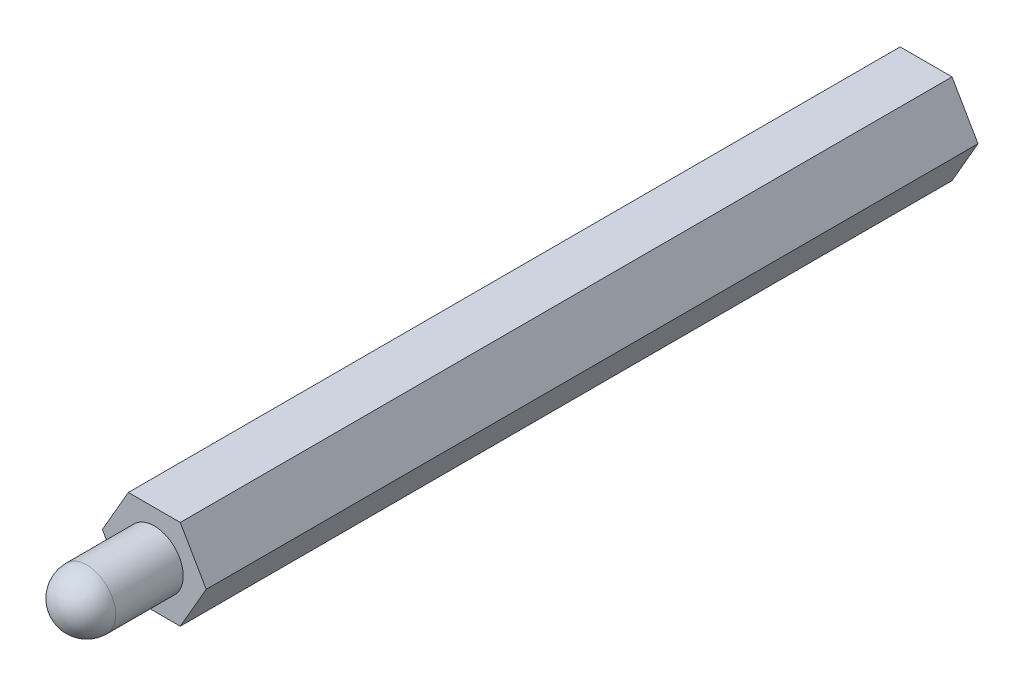
ISO-10303-21;
HEADER;
FILE_DESCRIPTION(('STEP AP214'),'2;1');
FILE_NAME('part.step','',(''),(''),'','','');
FILE_SCHEMA(('AUTOMOTIVE_DESIGN { 1 0 10303 214 1 1 1 1 }'));
ENDSEC;
DATA;
#1=APPLICATION_CONTEXT('core data for automotive mechanical design processes');
#2=APPLICATION_PROTOCOL_DEFINITION('international standard','automotive_design',2000,#1);
#3=PRODUCT_CONTEXT('',#1,'mechanical');
#4=PRODUCT('Part','Part','',(#3));
#5=PRODUCT_RELATED_PRODUCT_CATEGORY('part','',(#4));
#6=PRODUCT_DEFINITION_FORMATION('','',#4);
#7=PRODUCT_DEFINITION_CONTEXT('part definition',#1,'design');
#8=PRODUCT_DEFINITION('design','',#6,#7);
#9=PRODUCT_DEFINITION_SHAPE('','',#8);
#10=(LENGTH_UNIT() NAMED_UNIT(*) SI_UNIT(.MILLI.,.METRE.));
#11=(NAMED_UNIT(*) PLANE_ANGLE_UNIT() SI_UNIT($,.RADIAN.));
#12=(NAMED_UNIT(*) SI_UNIT($,.STERADIAN.) SOLID_ANGLE_UNIT());
#13=UNCERTAINTY_MEASURE_WITH_UNIT(LENGTH_MEASURE(1.E-05),#10,'distance_accuracy_value','');
#14=(GEOMETRIC_REPRESENTATION_CONTEXT(3) GLOBAL_UNCERTAINTY_ASSIGNED_CONTEXT((#13)) GLOBAL_UNIT_ASSIGNED_CONTEXT((#10,
#11,#12)) REPRESENTATION_CONTEXT('',''));
#15=CARTESIAN_POINT('',(0.,0.,0.));
#16=DIRECTION('',(0.,0.,1.));
#17=DIRECTION('',(1.,0.,0.));
#18=AXIS2_PLACEMENT_3D('',#15,#16,#17);
#19=CARTESIAN_POINT('',(0.,0.,40.));
#20=DIRECTION('',(0.,0.,1.));
#21=DIRECTION('',(1.,0.,0.));
#22=AXIS2_PLACEMENT_3D('',#19,#20,#21);
#23=PLANE('',#22);
#24=DIRECTION('',(0.499999999999995,0.866025403784442,0.));
#25=VECTOR('',#24,1.);
#26=CARTESIAN_POINT('',(1.34522612721185,-2.32999999999998,40.));
#27=LINE('',#26,#25);
#28=CARTESIAN_POINT('',(1.34522612721185,-2.32999999999998,40.));
#29=VERTEX_POINT('',#28);
#30=CARTESIAN_POINT('',(2.69045225442365,0.,40.));
#31=VERTEX_POINT('',#30);
#32=EDGE_CURVE('E131',#29,#31,#27,.T.);
#33=ORIENTED_EDGE('',*,*,#32,.T.);
#34=DIRECTION('',(-0.500000000000001,0.866025403784438,0.));
#35=VECTOR('',#34,1.);
#36=CARTESIAN_POINT('',(2.69045225442365,0.,40.));
#37=LINE('',#36,#35);
#38=CARTESIAN_POINT('',(1.34522612721182,2.33,40.));
#39=VERTEX_POINT('',#38);
#40=EDGE_CURVE('E89',#31,#39,#37,.T.);
#41=ORIENTED_EDGE('',*,*,#40,.T.);
#42=DIRECTION('',(-1.,0.,0.));
#43=VECTOR('',#42,1.);
#44=CARTESIAN_POINT('',(1.34522612721182,2.33,40.));
#45=LINE('',#44,#43);
#46=CARTESIAN_POINT('',(-1.34522612721183,2.32999999999999,40.));
#47=VERTEX_POINT('',#46);
#48=EDGE_CURVE('E102',#39,#47,#45,.T.);
#49=ORIENTED_EDGE('',*,*,#48,.T.);
#50=DIRECTION('',(-0.499999999999995,-0.866025403784441,0.));
#51=VECTOR('',#50,1.);
#52=CARTESIAN_POINT('',(-1.34522612721183,2.32999999999999,40.));
#53=LINE('',#52,#51);
#54=CARTESIAN_POINT('',(-2.69045225442365,0.,40.));
#55=VERTEX_POINT('',#54);
#56=EDGE_CURVE('E96',#47,#55,#53,.T.);
#57=ORIENTED_EDGE('',*,*,#56,.T.);
#58=DIRECTION('',(0.500000000000007,-0.866025403784435,0.));
#59=VECTOR('',#58,1.);
#60=CARTESIAN_POINT('',(-2.69045225442365,0.,40.));
#61=LINE('',#60,#59);
#62=CARTESIAN_POINT('',(-1.3452261272118,-2.33,40.));
#63=VERTEX_POINT('',#62);
#64=EDGE_CURVE('E100',#55,#63,#61,.T.);
#65=ORIENTED_EDGE('',*,*,#64,.T.);
#66=DIRECTION('',(1.,0.,0.));
#67=VECTOR('',#66,1.);
#68=CARTESIAN_POINT('',(-1.3452261272118,-2.33,40.));
#69=LINE('',#68,#67);
#70=EDGE_CURVE('E51',#63,#29,#69,.T.);
#71=ORIENTED_EDGE('',*,*,#70,.T.);
#72=EDGE_LOOP('',(#33,#41,#49,#57,#65,#71));
#73=FACE_BOUND('',#72,.T.);
#74=CARTESIAN_POINT('',(0.,0.,40.));
#75=DIRECTION('',(0.,0.,1.));
#76=DIRECTION('',(1.,0.,0.));
#77=AXIS2_PLACEMENT_3D('',#74,#75,#76);
#78=CIRCLE('',#77,1.5);
#79=CARTESIAN_POINT('',(1.5,0.,40.));
#80=VERTEX_POINT('',#79);
#81=EDGE_CURVE('E124',#80,#80,#78,.T.);
#82=ORIENTED_EDGE('',*,*,#81,.F.);
#83=EDGE_LOOP('',(#82));
#84=FACE_BOUND('',#83,.T.);
#85=ADVANCED_FACE('F34',(#73,#84),#23,.T.);
#86=CARTESIAN_POINT('',(1.34522612721185,-2.32999999999998,40.));
#87=DIRECTION('',(-0.866025403784442,0.499999999999995,0.));
#88=DIRECTION('',(-0.499999999999995,-0.866025403784442,0.));
#89=AXIS2_PLACEMENT_3D('',#86,#87,#88);
#90=PLANE('',#89);
#91=DIRECTION('',(0.499999999999995,0.866025403784442,0.));
#92=VECTOR('',#91,1.);
#93=CARTESIAN_POINT('',(1.34522612721185,-2.32999999999998,0.));
#94=LINE('',#93,#92);
#95=CARTESIAN_POINT('',(1.34522612721185,-2.32999999999998,0.));
#96=VERTEX_POINT('',#95);
#97=CARTESIAN_POINT('',(2.69045225442365,0.,0.));
#98=VERTEX_POINT('',#97);
#99=EDGE_CURVE('E120',#96,#98,#94,.T.);
#100=ORIENTED_EDGE('',*,*,#99,.T.);
#101=DIRECTION('',(0.,0.,-1.));
#102=VECTOR('',#101,1.);
#103=CARTESIAN_POINT('',(2.69045225442365,0.,40.));
#104=LINE('',#103,#102);
#105=EDGE_CURVE('E43',#31,#98,#104,.T.);
#106=ORIENTED_EDGE('',*,*,#105,.F.);
#107=ORIENTED_EDGE('',*,*,#32,.F.);
#108=DIRECTION('',(0.,0.,-1.));
#109=VECTOR('',#108,1.);
#110=CARTESIAN_POINT('',(1.34522612721185,-2.32999999999998,40.));
#111=LINE('',#110,#109);
#112=EDGE_CURVE('E116',#29,#96,#111,.T.);
#113=ORIENTED_EDGE('',*,*,#112,.T.);
#114=EDGE_LOOP('',(#100,#106,#107,#113));
#115=FACE_BOUND('',#114,.T.);
#116=ADVANCED_FACE('F142',(#115),#90,.F.);
#117=CARTESIAN_POINT('',(2.69045225442365,0.,40.));
#118=DIRECTION('',(-0.866025403784438,-0.500000000000001,0.));
#119=DIRECTION('',(0.500000000000001,-0.866025403784438,0.));
#120=AXIS2_PLACEMENT_3D('',#117,#118,#119);
#121=PLANE('',#120);
#122=DIRECTION('',(-0.500000000000001,0.866025403784438,0.));
#123=VECTOR('',#122,1.);
#124=CARTESIAN_POINT('',(2.69045225442365,0.,0.));
#125=LINE('',#124,#123);
#126=CARTESIAN_POINT('',(1.34522612721182,2.33,0.));
#127=VERTEX_POINT('',#126);
#128=EDGE_CURVE('E123',#98,#127,#125,.T.);
#129=ORIENTED_EDGE('',*,*,#128,.T.);
#130=DIRECTION('',(0.,0.,-1.));
#131=VECTOR('',#130,1.);
#132=CARTESIAN_POINT('',(1.34522612721182,2.33,40.));
#133=LINE('',#132,#131);
#134=EDGE_CURVE('E135',#39,#127,#133,.T.);
#135=ORIENTED_EDGE('',*,*,#134,.F.);
#136=ORIENTED_EDGE('',*,*,#40,.F.);
#137=ORIENTED_EDGE('',*,*,#105,.T.);
#138=EDGE_LOOP('',(#129,#135,#136,#137));
#139=FACE_BOUND('',#138,.T.);
#140=ADVANCED_FACE('F138',(#139),#121,.F.);
#141=CARTESIAN_POINT('',(1.34522612721182,2.33,40.));
#142=DIRECTION('',(0.,-1.,0.));
#143=DIRECTION('',(1.,0.,0.));
#144=AXIS2_PLACEMENT_3D('',#141,#142,#143);
#145=PLANE('',#144);
#146=DIRECTION('',(-1.,0.,0.));
#147=VECTOR('',#146,1.);
#148=CARTESIAN_POINT('',(1.34522612721182,2.33,0.));
#149=LINE('',#148,#147);
#150=CARTESIAN_POINT('',(-1.34522612721183,2.32999999999999,0.));
#151=VERTEX_POINT('',#150);
#152=EDGE_CURVE('E126',#127,#151,#149,.T.);
#153=ORIENTED_EDGE('',*,*,#152,.T.);
#154=DIRECTION('',(0.,0.,-1.));
#155=VECTOR('',#154,1.);
#156=CARTESIAN_POINT('',(-1.34522612721183,2.32999999999999,40.));
#157=LINE('',#156,#155);
#158=EDGE_CURVE('E111',#47,#151,#157,.T.);
#159=ORIENTED_EDGE('',*,*,#158,.F.);
#160=ORIENTED_EDGE('',*,*,#48,.F.);
#161=ORIENTED_EDGE('',*,*,#134,.T.);
#162=EDGE_LOOP('',(#153,#159,#160,#161));
#163=FACE_BOUND('',#162,.T.);
#164=ADVANCED_FACE('F147',(#163),#145,.F.);
#165=CARTESIAN_POINT('',(-1.34522612721183,2.32999999999999,40.));
#166=DIRECTION('',(0.866025403784442,-0.499999999999995,0.));
#167=DIRECTION('',(0.499999999999995,0.866025403784442,0.));
#168=AXIS2_PLACEMENT_3D('',#165,#166,#167);
#169=PLANE('',#168);
#170=DIRECTION('',(-0.499999999999995,-0.866025403784441,0.));
#171=VECTOR('',#170,1.);
#172=CARTESIAN_POINT('',(-1.34522612721183,2.32999999999999,0.));
#173=LINE('',#172,#171);
#174=CARTESIAN_POINT('',(-2.69045225442365,0.,0.));
#175=VERTEX_POINT('',#174);
#176=EDGE_CURVE('E110',#151,#175,#173,.T.);
#177=ORIENTED_EDGE('',*,*,#176,.T.);
#178=DIRECTION('',(0.,0.,-1.));
#179=VECTOR('',#178,1.);
#180=CARTESIAN_POINT('',(-2.69045225442365,0.,40.));
#181=LINE('',#180,#179);
#182=EDGE_CURVE('E107',#55,#175,#181,.T.);
#183=ORIENTED_EDGE('',*,*,#182,.F.);
#184=ORIENTED_EDGE('',*,*,#56,.F.);
#185=ORIENTED_EDGE('',*,*,#158,.T.);
#186=EDGE_LOOP('',(#177,#183,#184,#185));
#187=FACE_BOUND('',#186,.T.);
#188=ADVANCED_FACE('F108',(#187),#169,.F.);
#189=CARTESIAN_POINT('',(-2.69045225442365,0.,40.));
#190=DIRECTION('',(0.866025403784435,0.500000000000007,0.));
#191=DIRECTION('',(-0.500000000000007,0.866025403784435,0.));
#192=AXIS2_PLACEMENT_3D('',#189,#190,#191);
#193=PLANE('',#192);
#194=DIRECTION('',(0.500000000000007,-0.866025403784435,0.));
#195=VECTOR('',#194,1.);
#196=CARTESIAN_POINT('',(-2.69045225442365,0.,0.));
#197=LINE('',#196,#195);
#198=CARTESIAN_POINT('',(-1.3452261272118,-2.33,0.));
#199=VERTEX_POINT('',#198);
#200=EDGE_CURVE('E74',#175,#199,#197,.T.);
#201=ORIENTED_EDGE('',*,*,#200,.T.);
#202=DIRECTION('',(0.,0.,-1.));
#203=VECTOR('',#202,1.);
#204=CARTESIAN_POINT('',(-1.3452261272118,-2.33,40.));
#205=LINE('',#204,#203);
#206=EDGE_CURVE('E112',#63,#199,#205,.T.);
#207=ORIENTED_EDGE('',*,*,#206,.F.);
#208=ORIENTED_EDGE('',*,*,#64,.F.);
#209=ORIENTED_EDGE('',*,*,#182,.T.);
#210=EDGE_LOOP('',(#201,#207,#208,#209));
#211=FACE_BOUND('',#210,.T.);
#212=ADVANCED_FACE('F114',(#211),#193,.F.);
#213=CARTESIAN_POINT('',(-1.3452261272118,-2.33,40.));
#214=DIRECTION('',(0.,1.,0.));
#215=DIRECTION('',(-1.,0.,0.));
#216=AXIS2_PLACEMENT_3D('',#213,#214,#215);
#217=PLANE('',#216);
#218=DIRECTION('',(1.,0.,0.));
#219=VECTOR('',#218,1.);
#220=CARTESIAN_POINT('',(-1.3452261272118,-2.33,0.));
#221=LINE('',#220,#219);
#222=EDGE_CURVE('E80',#199,#96,#221,.T.);
#223=ORIENTED_EDGE('',*,*,#222,.T.);
#224=ORIENTED_EDGE('',*,*,#112,.F.);
#225=ORIENTED_EDGE('',*,*,#70,.F.);
#226=ORIENTED_EDGE('',*,*,#206,.T.);
#227=EDGE_LOOP('',(#223,#224,#225,#226));
#228=FACE_BOUND('',#227,.T.);
#229=ADVANCED_FACE('F164',(#228),#217,.F.);
#230=CARTESIAN_POINT('',(0.,0.,0.));
#231=DIRECTION('',(0.,0.,1.));
#232=DIRECTION('',(1.,0.,0.));
#233=AXIS2_PLACEMENT_3D('',#230,#231,#232);
#234=PLANE('',#233);
#235=ORIENTED_EDGE('',*,*,#99,.F.);
#236=ORIENTED_EDGE('',*,*,#222,.F.);
#237=ORIENTED_EDGE('',*,*,#200,.F.);
#238=ORIENTED_EDGE('',*,*,#176,.F.);
#239=ORIENTED_EDGE('',*,*,#152,.F.);
#240=ORIENTED_EDGE('',*,*,#128,.F.);
#241=EDGE_LOOP('',(#235,#236,#237,#238,#239,#240));
#242=FACE_BOUND('',#241,.T.);
#243=ADVANCED_FACE('F144',(#242),#234,.F.);
#244=CARTESIAN_POINT('',(0.,0.,45.));
#245=DIRECTION('',(0.,0.,-1.));
#246=DIRECTION('',(-1.,0.,0.));
#247=AXIS2_PLACEMENT_3D('',#244,#245,#246);
#248=CYLINDRICAL_SURFACE('',#247,1.5);
#249=CARTESIAN_POINT('',(0.,0.,43.5));
#250=DIRECTION('',(0.,0.,-1.));
#251=DIRECTION('',(-1.,0.,0.));
#252=AXIS2_PLACEMENT_3D('',#249,#250,#251);
#253=CIRCLE('',#252,1.5);
#254=CARTESIAN_POINT('',(-1.5,0.,43.5));
#255=VERTEX_POINT('',#254);
#256=EDGE_CURVE('E11',#255,#255,#253,.T.);
#257=ORIENTED_EDGE('',*,*,#256,.T.);
#258=EDGE_LOOP('',(#257));
#259=FACE_BOUND('',#258,.T.);
#260=ORIENTED_EDGE('',*,*,#81,.T.);
#261=EDGE_LOOP('',(#260));
#262=FACE_BOUND('',#261,.T.);
#263=ADVANCED_FACE('F154',(#259,#262),#248,.T.);
#264=CARTESIAN_POINT('',(0.,0.,43.5));
#265=DIRECTION('',(0.,0.,1.));
#266=DIRECTION('',(1.,0.,0.));
#267=AXIS2_PLACEMENT_3D('',#264,#265,#266);
#268=SPHERICAL_SURFACE('',#267,1.5);
#269=ORIENTED_EDGE('',*,*,#256,.F.);
#270=EDGE_LOOP('',(#269));
#271=FACE_BOUND('',#270,.T.);
#272=ADVANCED_FACE('F36',(#271),#268,.T.);
#273=CLOSED_SHELL('',(#85,#116,#140,#164,#188,#212,#229,#243,#263,#272));
#274=MANIFOLD_SOLID_BREP('B2',#273);
#275=ADVANCED_BREP_SHAPE_REPRESENTATION('',(#18,#274),#14);
#276=SHAPE_DEFINITION_REPRESENTATION(#9,#275);
ENDSEC;
END-ISO-10303-21;
